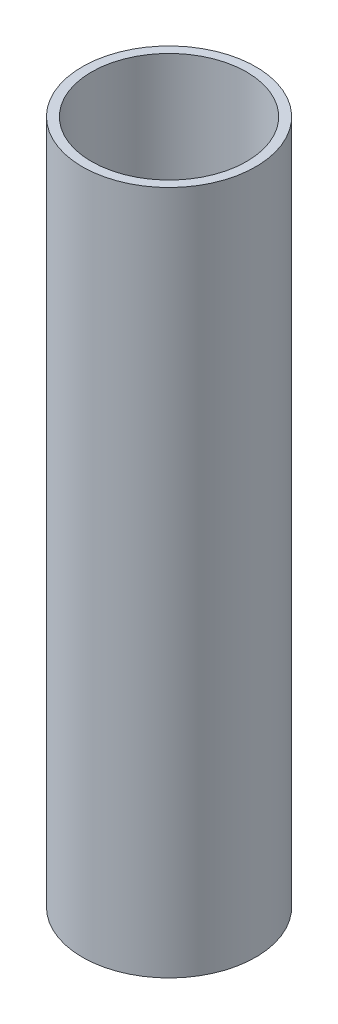
ISO-10303-21;
HEADER;
FILE_DESCRIPTION(('STEP AP214'),'2;1');
FILE_NAME('part.step','',(''),(''),'','','');
FILE_SCHEMA(('AUTOMOTIVE_DESIGN { 1 0 10303 214 1 1 1 1 }'));
ENDSEC;
DATA;
#1=APPLICATION_CONTEXT('core data for automotive mechanical design processes');
#2=APPLICATION_PROTOCOL_DEFINITION('international standard','automotive_design',2000,#1);
#3=PRODUCT_CONTEXT('',#1,'mechanical');
#4=PRODUCT('Part','Part','',(#3));
#5=PRODUCT_RELATED_PRODUCT_CATEGORY('part','',(#4));
#6=PRODUCT_DEFINITION_FORMATION('','',#4);
#7=PRODUCT_DEFINITION_CONTEXT('part definition',#1,'design');
#8=PRODUCT_DEFINITION('design','',#6,#7);
#9=PRODUCT_DEFINITION_SHAPE('','',#8);
#10=(LENGTH_UNIT() NAMED_UNIT(*) SI_UNIT(.MILLI.,.METRE.));
#11=(NAMED_UNIT(*) PLANE_ANGLE_UNIT() SI_UNIT($,.RADIAN.));
#12=(NAMED_UNIT(*) SI_UNIT($,.STERADIAN.) SOLID_ANGLE_UNIT());
#13=UNCERTAINTY_MEASURE_WITH_UNIT(LENGTH_MEASURE(1.E-05),#10,'distance_accuracy_value','');
#14=(GEOMETRIC_REPRESENTATION_CONTEXT(3) GLOBAL_UNCERTAINTY_ASSIGNED_CONTEXT((#13)) GLOBAL_UNIT_ASSIGNED_CONTEXT((#10,
#11,#12)) REPRESENTATION_CONTEXT('',''));
#15=CARTESIAN_POINT('',(0.,0.,0.));
#16=DIRECTION('',(0.,0.,1.));
#17=DIRECTION('',(1.,0.,0.));
#18=AXIS2_PLACEMENT_3D('',#15,#16,#17);
#19=CARTESIAN_POINT('',(0.,26.1689859870494,0.));
#20=DIRECTION('',(0.,1.,0.));
#21=DIRECTION('',(0.,0.,1.));
#22=AXIS2_PLACEMENT_3D('',#19,#20,#21);
#23=CYLINDRICAL_SURFACE('',#22,38.);
#24=CARTESIAN_POINT('',(0.,0.,0.));
#25=DIRECTION('',(0.,1.,0.));
#26=DIRECTION('',(0.,0.,1.));
#27=AXIS2_PLACEMENT_3D('',#24,#25,#26);
#28=CIRCLE('',#27,38.);
#29=CARTESIAN_POINT('',(0.,0.,38.));
#30=VERTEX_POINT('',#29);
#31=EDGE_CURVE('E47',#30,#30,#28,.T.);
#32=ORIENTED_EDGE('',*,*,#31,.T.);
#33=EDGE_LOOP('',(#32));
#34=FACE_BOUND('',#33,.T.);
#35=CARTESIAN_POINT('',(0.,300.,0.));
#36=DIRECTION('',(0.,1.,0.));
#37=DIRECTION('',(0.,0.,1.));
#38=AXIS2_PLACEMENT_3D('',#35,#36,#37);
#39=CIRCLE('',#38,38.);
#40=CARTESIAN_POINT('',(0.,300.,38.));
#41=VERTEX_POINT('',#40);
#42=EDGE_CURVE('E10',#41,#41,#39,.T.);
#43=ORIENTED_EDGE('',*,*,#42,.F.);
#44=EDGE_LOOP('',(#43));
#45=FACE_BOUND('',#44,.T.);
#46=ADVANCED_FACE('F33',(#34,#45),#23,.T.);
#47=CARTESIAN_POINT('',(-38.,300.,0.));
#48=DIRECTION('',(0.,-1.,0.));
#49=DIRECTION('',(0.,0.,-1.));
#50=AXIS2_PLACEMENT_3D('',#47,#48,#49);
#51=PLANE('',#50);
#52=CARTESIAN_POINT('',(0.,300.,0.));
#53=DIRECTION('',(0.,1.,0.));
#54=DIRECTION('',(0.,0.,1.));
#55=AXIS2_PLACEMENT_3D('',#52,#53,#54);
#56=CIRCLE('',#55,34.);
#57=CARTESIAN_POINT('',(0.,300.,34.));
#58=VERTEX_POINT('',#57);
#59=EDGE_CURVE('E39',#58,#58,#56,.T.);
#60=ORIENTED_EDGE('',*,*,#59,.F.);
#61=EDGE_LOOP('',(#60));
#62=FACE_BOUND('',#61,.T.);
#63=ORIENTED_EDGE('',*,*,#42,.T.);
#64=EDGE_LOOP('',(#63));
#65=FACE_BOUND('',#64,.T.);
#66=ADVANCED_FACE('F63',(#62,#65),#51,.F.);
#67=CARTESIAN_POINT('',(0.,26.1689859870494,0.));
#68=DIRECTION('',(0.,1.,0.));
#69=DIRECTION('',(0.,0.,1.));
#70=AXIS2_PLACEMENT_3D('',#67,#68,#69);
#71=CYLINDRICAL_SURFACE('',#70,34.);
#72=CARTESIAN_POINT('',(0.,0.,0.));
#73=DIRECTION('',(0.,1.,0.));
#74=DIRECTION('',(0.,0.,1.));
#75=AXIS2_PLACEMENT_3D('',#72,#73,#74);
#76=CIRCLE('',#75,34.);
#77=CARTESIAN_POINT('',(0.,0.,34.));
#78=VERTEX_POINT('',#77);
#79=EDGE_CURVE('E43',#78,#78,#76,.T.);
#80=ORIENTED_EDGE('',*,*,#79,.F.);
#81=EDGE_LOOP('',(#80));
#82=FACE_BOUND('',#81,.T.);
#83=ORIENTED_EDGE('',*,*,#59,.T.);
#84=EDGE_LOOP('',(#83));
#85=FACE_BOUND('',#84,.T.);
#86=ADVANCED_FACE('F58',(#82,#85),#71,.F.);
#87=CARTESIAN_POINT('',(-34.,0.,0.));
#88=DIRECTION('',(0.,1.,0.));
#89=DIRECTION('',(0.,0.,1.));
#90=AXIS2_PLACEMENT_3D('',#87,#88,#89);
#91=PLANE('',#90);
#92=ORIENTED_EDGE('',*,*,#31,.F.);
#93=EDGE_LOOP('',(#92));
#94=FACE_BOUND('',#93,.T.);
#95=ORIENTED_EDGE('',*,*,#79,.T.);
#96=EDGE_LOOP('',(#95));
#97=FACE_BOUND('',#96,.T.);
#98=ADVANCED_FACE('F55',(#94,#97),#91,.F.);
#99=CLOSED_SHELL('',(#46,#66,#86,#98));
#100=MANIFOLD_SOLID_BREP('B2',#99);
#101=ADVANCED_BREP_SHAPE_REPRESENTATION('',(#18,#100),#14);
#102=SHAPE_DEFINITION_REPRESENTATION(#9,#101);
ENDSEC;
END-ISO-10303-21;
